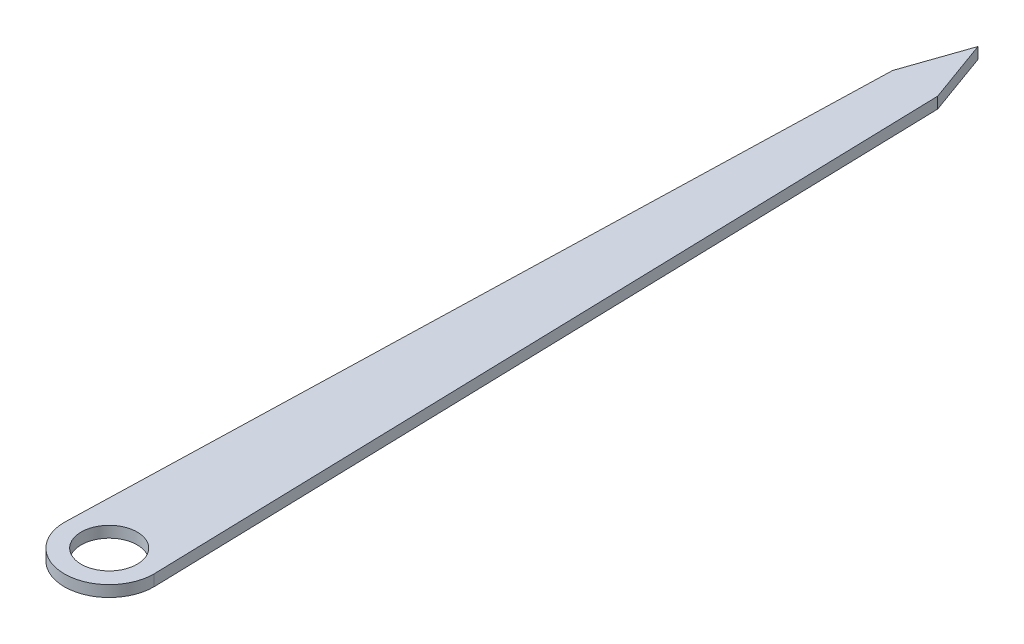
ISO-10303-21;
HEADER;
FILE_DESCRIPTION(('STEP AP214'),'2;1');
FILE_NAME('part.step','',(''),(''),'','','');
FILE_SCHEMA(('AUTOMOTIVE_DESIGN { 1 0 10303 214 1 1 1 1 }'));
ENDSEC;
DATA;
#1=APPLICATION_CONTEXT('core data for automotive mechanical design processes');
#2=APPLICATION_PROTOCOL_DEFINITION('international standard','automotive_design',2000,#1);
#3=PRODUCT_CONTEXT('',#1,'mechanical');
#4=PRODUCT('Part','Part','',(#3));
#5=PRODUCT_RELATED_PRODUCT_CATEGORY('part','',(#4));
#6=PRODUCT_DEFINITION_FORMATION('','',#4);
#7=PRODUCT_DEFINITION_CONTEXT('part definition',#1,'design');
#8=PRODUCT_DEFINITION('design','',#6,#7);
#9=PRODUCT_DEFINITION_SHAPE('','',#8);
#10=(LENGTH_UNIT() NAMED_UNIT(*) SI_UNIT(.MILLI.,.METRE.));
#11=(NAMED_UNIT(*) PLANE_ANGLE_UNIT() SI_UNIT($,.RADIAN.));
#12=(NAMED_UNIT(*) SI_UNIT($,.STERADIAN.) SOLID_ANGLE_UNIT());
#13=UNCERTAINTY_MEASURE_WITH_UNIT(LENGTH_MEASURE(1.E-05),#10,'distance_accuracy_value','');
#14=(GEOMETRIC_REPRESENTATION_CONTEXT(3) GLOBAL_UNCERTAINTY_ASSIGNED_CONTEXT((#13)) GLOBAL_UNIT_ASSIGNED_CONTEXT((#10,
#11,#12)) REPRESENTATION_CONTEXT('',''));
#15=CARTESIAN_POINT('',(0.,0.,0.));
#16=DIRECTION('',(0.,0.,1.));
#17=DIRECTION('',(1.,0.,0.));
#18=AXIS2_PLACEMENT_3D('',#15,#16,#17);
#19=CARTESIAN_POINT('',(104.951451368837,2.,2.97615330015618));
#20=DIRECTION('',(-0.999598170448803,0.,-0.028346033856704));
#21=DIRECTION('',(-0.028346033856704,0.,0.999598170448803));
#22=AXIS2_PLACEMENT_3D('',#19,#20,#21);
#23=PLANE('',#22);
#24=DIRECTION('',(0.028346033856704,0.,-0.999598170448803));
#25=VECTOR('',#24,1.);
#26=CARTESIAN_POINT('',(104.951451368837,1.,2.97615330015618));
#27=LINE('',#26,#25);
#28=CARTESIAN_POINT('',(106.,1.,-34.));
#29=VERTEX_POINT('',#28);
#30=CARTESIAN_POINT('',(108.040914437683,1.,-105.971068272314));
#31=VERTEX_POINT('',#30);
#32=EDGE_CURVE('E50',#29,#31,#27,.T.);
#33=ORIENTED_EDGE('',*,*,#32,.F.);
#34=DIRECTION('',(0.,-1.,0.));
#35=VECTOR('',#34,1.);
#36=CARTESIAN_POINT('',(106.,2.,-34.));
#37=LINE('',#36,#35);
#38=CARTESIAN_POINT('',(106.,2.,-34.));
#39=VERTEX_POINT('',#38);
#40=EDGE_CURVE('E11',#39,#29,#37,.T.);
#41=ORIENTED_EDGE('',*,*,#40,.F.);
#42=DIRECTION('',(0.028346033856704,0.,-0.999598170448803));
#43=VECTOR('',#42,1.);
#44=CARTESIAN_POINT('',(104.951451368837,2.,2.97615330015618));
#45=LINE('',#44,#43);
#46=CARTESIAN_POINT('',(108.040914437683,2.,-105.971068272314));
#47=VERTEX_POINT('',#46);
#48=EDGE_CURVE('E99',#39,#47,#45,.T.);
#49=ORIENTED_EDGE('',*,*,#48,.T.);
#50=DIRECTION('',(0.,-1.,0.));
#51=VECTOR('',#50,1.);
#52=CARTESIAN_POINT('',(108.040914437683,2.,-105.971068272314));
#53=LINE('',#52,#51);
#54=EDGE_CURVE('E57',#47,#31,#53,.T.);
#55=ORIENTED_EDGE('',*,*,#54,.T.);
#56=EDGE_LOOP('',(#33,#41,#49,#55));
#57=FACE_BOUND('',#56,.T.);
#58=ADVANCED_FACE('F35',(#57),#23,.T.);
#59=CARTESIAN_POINT('',(110.,2.,-34.));
#60=DIRECTION('',(0.,-1.,0.));
#61=DIRECTION('',(0.,0.,-1.));
#62=AXIS2_PLACEMENT_3D('',#59,#60,#61);
#63=CYLINDRICAL_SURFACE('',#62,3.99999999999999);
#64=ORIENTED_EDGE('',*,*,#40,.T.);
#65=CARTESIAN_POINT('',(110.,1.,-34.));
#66=DIRECTION('',(0.,1.,0.));
#67=DIRECTION('',(0.,0.,1.));
#68=AXIS2_PLACEMENT_3D('',#65,#66,#67);
#69=CIRCLE('',#68,3.99999999999999);
#70=CARTESIAN_POINT('',(114.,1.,-34.));
#71=VERTEX_POINT('',#70);
#72=EDGE_CURVE('E81',#29,#71,#69,.T.);
#73=ORIENTED_EDGE('',*,*,#72,.T.);
#74=DIRECTION('',(0.,-1.,0.));
#75=VECTOR('',#74,1.);
#76=CARTESIAN_POINT('',(114.,2.,-34.));
#77=LINE('',#76,#75);
#78=CARTESIAN_POINT('',(114.,2.,-34.));
#79=VERTEX_POINT('',#78);
#80=EDGE_CURVE('E43',#79,#71,#77,.T.);
#81=ORIENTED_EDGE('',*,*,#80,.F.);
#82=CARTESIAN_POINT('',(110.,2.,-34.));
#83=DIRECTION('',(0.,1.,0.));
#84=DIRECTION('',(0.,0.,1.));
#85=AXIS2_PLACEMENT_3D('',#82,#83,#84);
#86=CIRCLE('',#85,3.99999999999999);
#87=EDGE_CURVE('E94',#39,#79,#86,.T.);
#88=ORIENTED_EDGE('',*,*,#87,.F.);
#89=EDGE_LOOP('',(#64,#73,#81,#88));
#90=FACE_BOUND('',#89,.T.);
#91=ADVANCED_FACE('F93',(#90),#63,.T.);
#92=CARTESIAN_POINT('',(114.840100942145,2.,-3.12474421848353));
#93=DIRECTION('',(-0.999630026386503,0.,0.0271994548937866));
#94=DIRECTION('',(0.0271994548937866,0.,0.999630026386503));
#95=AXIS2_PLACEMENT_3D('',#92,#93,#94);
#96=PLANE('',#95);
#97=ORIENTED_EDGE('',*,*,#80,.T.);
#98=DIRECTION('',(-0.0271994548937866,0.,-0.999630026386503));
#99=VECTOR('',#98,1.);
#100=CARTESIAN_POINT('',(114.840100942145,1.,-3.12474421848353));
#101=LINE('',#100,#99);
#102=CARTESIAN_POINT('',(112.040914437683,1.,-106.));
#103=VERTEX_POINT('',#102);
#104=EDGE_CURVE('E85',#71,#103,#101,.T.);
#105=ORIENTED_EDGE('',*,*,#104,.T.);
#106=DIRECTION('',(0.,-1.,0.));
#107=VECTOR('',#106,1.);
#108=CARTESIAN_POINT('',(112.040914437683,2.,-106.));
#109=LINE('',#108,#107);
#110=CARTESIAN_POINT('',(112.040914437683,2.,-106.));
#111=VERTEX_POINT('',#110);
#112=EDGE_CURVE('E118',#111,#103,#109,.T.);
#113=ORIENTED_EDGE('',*,*,#112,.F.);
#114=DIRECTION('',(-0.0271994548937866,0.,-0.999630026386503));
#115=VECTOR('',#114,1.);
#116=CARTESIAN_POINT('',(114.840100942145,2.,-3.12474421848353));
#117=LINE('',#116,#115);
#118=EDGE_CURVE('E98',#79,#111,#117,.T.);
#119=ORIENTED_EDGE('',*,*,#118,.F.);
#120=EDGE_LOOP('',(#97,#105,#113,#119));
#121=FACE_BOUND('',#120,.T.);
#122=ADVANCED_FACE('F122',(#121),#96,.F.);
#123=CARTESIAN_POINT('',(132.983508734658,2.,-48.1030286521325));
#124=DIRECTION('',(-0.940370320938311,0.,0.340152406280447));
#125=DIRECTION('',(0.340152406280447,0.,0.940370320938311));
#126=AXIS2_PLACEMENT_3D('',#123,#124,#125);
#127=PLANE('',#126);
#128=ORIENTED_EDGE('',*,*,#112,.T.);
#129=DIRECTION('',(-0.340152406280447,0.,-0.940370320938311));
#130=VECTOR('',#129,1.);
#131=CARTESIAN_POINT('',(132.983508734658,1.,-48.1030286521325));
#132=LINE('',#131,#130);
#133=CARTESIAN_POINT('',(110.,1.,-111.64222192563));
#134=VERTEX_POINT('',#133);
#135=EDGE_CURVE('E129',#103,#134,#132,.T.);
#136=ORIENTED_EDGE('',*,*,#135,.T.);
#137=DIRECTION('',(0.,-1.,0.));
#138=VECTOR('',#137,1.);
#139=CARTESIAN_POINT('',(110.,2.,-111.64222192563));
#140=LINE('',#139,#138);
#141=CARTESIAN_POINT('',(110.,2.,-111.64222192563));
#142=VERTEX_POINT('',#141);
#143=EDGE_CURVE('E115',#142,#134,#140,.T.);
#144=ORIENTED_EDGE('',*,*,#143,.F.);
#145=DIRECTION('',(-0.340152406280447,0.,-0.940370320938311));
#146=VECTOR('',#145,1.);
#147=CARTESIAN_POINT('',(132.983508734658,2.,-48.1030286521325));
#148=LINE('',#147,#146);
#149=EDGE_CURVE('E111',#111,#142,#148,.T.);
#150=ORIENTED_EDGE('',*,*,#149,.F.);
#151=EDGE_LOOP('',(#128,#136,#144,#150));
#152=FACE_BOUND('',#151,.T.);
#153=ADVANCED_FACE('F128',(#152),#127,.F.);
#154=CARTESIAN_POINT('',(63.8178444198189,2.,22.0457115542929));
#155=DIRECTION('',(-0.945192275552673,0.,-0.326514260386219));
#156=DIRECTION('',(-0.326514260386219,0.,0.945192275552673));
#157=AXIS2_PLACEMENT_3D('',#154,#155,#156);
#158=PLANE('',#157);
#159=DIRECTION('',(0.326514260386219,0.,-0.945192275552673));
#160=VECTOR('',#159,1.);
#161=CARTESIAN_POINT('',(63.8178444198189,1.,22.0457115542929));
#162=LINE('',#161,#160);
#163=EDGE_CURVE('E131',#31,#134,#162,.T.);
#164=ORIENTED_EDGE('',*,*,#163,.F.);
#165=ORIENTED_EDGE('',*,*,#54,.F.);
#166=DIRECTION('',(0.326514260386219,0.,-0.945192275552673));
#167=VECTOR('',#166,1.);
#168=CARTESIAN_POINT('',(63.8178444198189,2.,22.0457115542929));
#169=LINE('',#168,#167);
#170=EDGE_CURVE('E103',#47,#142,#169,.T.);
#171=ORIENTED_EDGE('',*,*,#170,.T.);
#172=ORIENTED_EDGE('',*,*,#143,.T.);
#173=EDGE_LOOP('',(#164,#165,#171,#172));
#174=FACE_BOUND('',#173,.T.);
#175=ADVANCED_FACE('F130',(#174),#158,.T.);
#176=CARTESIAN_POINT('',(0.,2.,0.));
#177=DIRECTION('',(0.,1.,0.));
#178=DIRECTION('',(0.,0.,1.));
#179=AXIS2_PLACEMENT_3D('',#176,#177,#178);
#180=PLANE('',#179);
#181=CARTESIAN_POINT('',(110.,2.,-34.));
#182=DIRECTION('',(0.,1.,0.));
#183=DIRECTION('',(0.,0.,1.));
#184=AXIS2_PLACEMENT_3D('',#181,#182,#183);
#185=CIRCLE('',#184,2.50000000000001);
#186=CARTESIAN_POINT('',(110.,2.,-31.5));
#187=VERTEX_POINT('',#186);
#188=EDGE_CURVE('E104',#187,#187,#185,.T.);
#189=ORIENTED_EDGE('',*,*,#188,.F.);
#190=EDGE_LOOP('',(#189));
#191=FACE_BOUND('',#190,.T.);
#192=ORIENTED_EDGE('',*,*,#48,.F.);
#193=ORIENTED_EDGE('',*,*,#87,.T.);
#194=ORIENTED_EDGE('',*,*,#118,.T.);
#195=ORIENTED_EDGE('',*,*,#149,.T.);
#196=ORIENTED_EDGE('',*,*,#170,.F.);
#197=EDGE_LOOP('',(#192,#193,#194,#195,#196));
#198=FACE_BOUND('',#197,.T.);
#199=ADVANCED_FACE('F102',(#191,#198),#180,.T.);
#200=CARTESIAN_POINT('',(110.,-16.,-34.));
#201=DIRECTION('',(0.,1.,0.));
#202=DIRECTION('',(0.,0.,1.));
#203=AXIS2_PLACEMENT_3D('',#200,#201,#202);
#204=CYLINDRICAL_SURFACE('',#203,2.50000000000001);
#205=CARTESIAN_POINT('',(110.,1.,-34.));
#206=DIRECTION('',(0.,1.,0.));
#207=DIRECTION('',(0.,0.,1.));
#208=AXIS2_PLACEMENT_3D('',#205,#206,#207);
#209=CIRCLE('',#208,2.50000000000001);
#210=CARTESIAN_POINT('',(110.,1.,-31.5));
#211=VERTEX_POINT('',#210);
#212=EDGE_CURVE('E38',#211,#211,#209,.F.);
#213=ORIENTED_EDGE('',*,*,#212,.T.);
#214=EDGE_LOOP('',(#213));
#215=FACE_BOUND('',#214,.T.);
#216=ORIENTED_EDGE('',*,*,#188,.T.);
#217=EDGE_LOOP('',(#216));
#218=FACE_BOUND('',#217,.T.);
#219=ADVANCED_FACE('F138',(#215,#218),#204,.F.);
#220=CARTESIAN_POINT('',(0.,1.,0.));
#221=DIRECTION('',(0.,1.,0.));
#222=DIRECTION('',(0.,0.,1.));
#223=AXIS2_PLACEMENT_3D('',#220,#221,#222);
#224=PLANE('',#223);
#225=ORIENTED_EDGE('',*,*,#32,.T.);
#226=ORIENTED_EDGE('',*,*,#163,.T.);
#227=ORIENTED_EDGE('',*,*,#135,.F.);
#228=ORIENTED_EDGE('',*,*,#104,.F.);
#229=ORIENTED_EDGE('',*,*,#72,.F.);
#230=EDGE_LOOP('',(#225,#226,#227,#228,#229));
#231=FACE_BOUND('',#230,.T.);
#232=ORIENTED_EDGE('',*,*,#212,.F.);
#233=EDGE_LOOP('',(#232));
#234=FACE_BOUND('',#233,.T.);
#235=ADVANCED_FACE('F82',(#231,#234),#224,.F.);
#236=CLOSED_SHELL('',(#58,#91,#122,#153,#175,#199,#219,#235));
#237=MANIFOLD_SOLID_BREP('B2',#236);
#238=ADVANCED_BREP_SHAPE_REPRESENTATION('',(#18,#237),#14);
#239=SHAPE_DEFINITION_REPRESENTATION(#9,#238);
ENDSEC;
END-ISO-10303-21;
